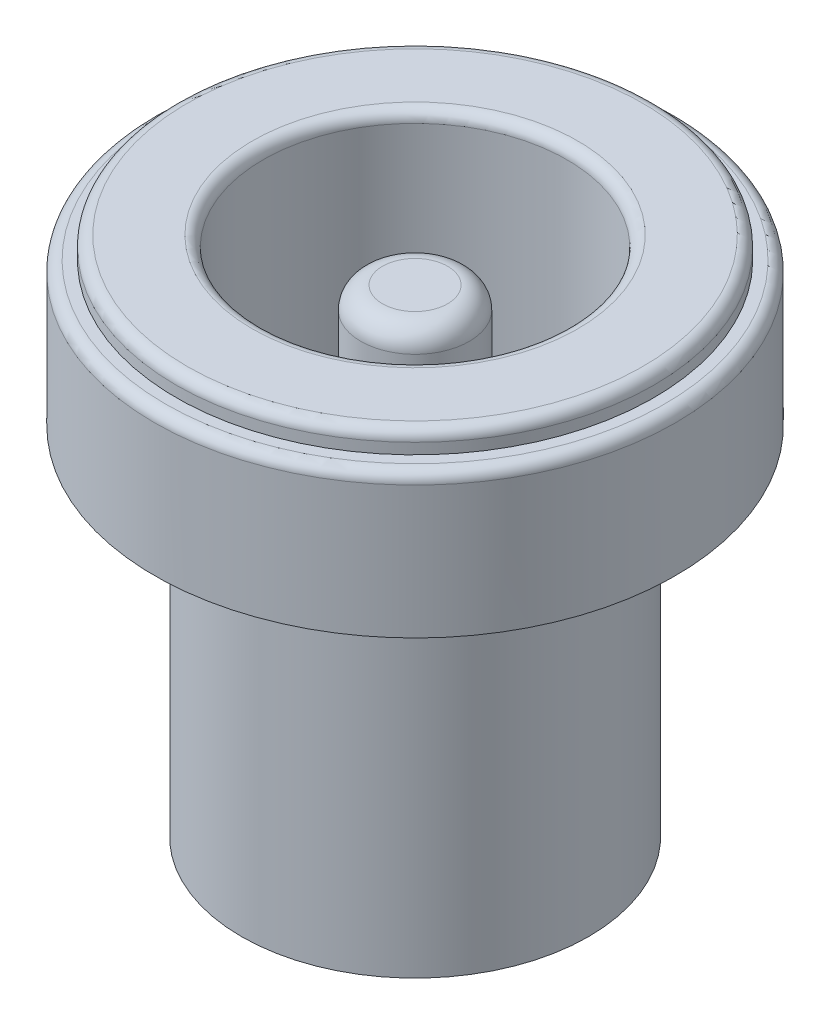
ISO-10303-21;
HEADER;
FILE_DESCRIPTION(('STEP AP214'),'2;1');
FILE_NAME('part.step','',(''),(''),'','','');
FILE_SCHEMA(('AUTOMOTIVE_DESIGN { 1 0 10303 214 1 1 1 1 }'));
ENDSEC;
DATA;
#1=APPLICATION_CONTEXT('core data for automotive mechanical design processes');
#2=APPLICATION_PROTOCOL_DEFINITION('international standard','automotive_design',2000,#1);
#3=PRODUCT_CONTEXT('',#1,'mechanical');
#4=PRODUCT('Part','Part','',(#3));
#5=PRODUCT_RELATED_PRODUCT_CATEGORY('part','',(#4));
#6=PRODUCT_DEFINITION_FORMATION('','',#4);
#7=PRODUCT_DEFINITION_CONTEXT('part definition',#1,'design');
#8=PRODUCT_DEFINITION('design','',#6,#7);
#9=PRODUCT_DEFINITION_SHAPE('','',#8);
#10=(LENGTH_UNIT() NAMED_UNIT(*) SI_UNIT(.MILLI.,.METRE.));
#11=(NAMED_UNIT(*) PLANE_ANGLE_UNIT() SI_UNIT($,.RADIAN.));
#12=(NAMED_UNIT(*) SI_UNIT($,.STERADIAN.) SOLID_ANGLE_UNIT());
#13=UNCERTAINTY_MEASURE_WITH_UNIT(LENGTH_MEASURE(1.E-05),#10,'distance_accuracy_value','');
#14=(GEOMETRIC_REPRESENTATION_CONTEXT(3) GLOBAL_UNCERTAINTY_ASSIGNED_CONTEXT((#13)) GLOBAL_UNIT_ASSIGNED_CONTEXT((#10,
#11,#12)) REPRESENTATION_CONTEXT('',''));
#15=CARTESIAN_POINT('',(0.,0.,0.));
#16=DIRECTION('',(0.,0.,1.));
#17=DIRECTION('',(1.,0.,0.));
#18=AXIS2_PLACEMENT_3D('',#15,#16,#17);
#19=CARTESIAN_POINT('',(0.,-10.,0.));
#20=DIRECTION('',(0.,1.,0.));
#21=DIRECTION('',(0.,0.,1.));
#22=AXIS2_PLACEMENT_3D('',#19,#20,#21);
#23=CYLINDRICAL_SURFACE('',#22,1.25);
#24=CARTESIAN_POINT('',(0.,-1.5,0.));
#25=DIRECTION('',(0.,1.,0.));
#26=DIRECTION('',(0.,0.,1.));
#27=AXIS2_PLACEMENT_3D('',#24,#25,#26);
#28=CIRCLE('',#27,1.25);
#29=CARTESIAN_POINT('',(0.,-1.5,1.25));
#30=VERTEX_POINT('',#29);
#31=EDGE_CURVE('E81',#30,#30,#28,.F.);
#32=ORIENTED_EDGE('',*,*,#31,.T.);
#33=EDGE_LOOP('',(#32));
#34=FACE_BOUND('',#33,.T.);
#35=CARTESIAN_POINT('',(0.,-10.,0.));
#36=DIRECTION('',(0.,1.,0.));
#37=DIRECTION('',(0.,0.,1.));
#38=AXIS2_PLACEMENT_3D('',#35,#36,#37);
#39=CIRCLE('',#38,1.25);
#40=CARTESIAN_POINT('',(0.,-10.,1.25));
#41=VERTEX_POINT('',#40);
#42=EDGE_CURVE('E105',#41,#41,#39,.T.);
#43=ORIENTED_EDGE('',*,*,#42,.T.);
#44=EDGE_LOOP('',(#43));
#45=FACE_BOUND('',#44,.T.);
#46=ADVANCED_FACE('F41',(#34,#45),#23,.T.);
#47=CARTESIAN_POINT('',(0.,0.,0.));
#48=DIRECTION('',(0.,1.,0.));
#49=DIRECTION('',(0.,0.,1.));
#50=AXIS2_PLACEMENT_3D('',#47,#48,#49);
#51=PLANE('',#50);
#52=CARTESIAN_POINT('',(0.,0.,0.));
#53=DIRECTION('',(0.,1.,0.));
#54=DIRECTION('',(0.,0.,1.));
#55=AXIS2_PLACEMENT_3D('',#52,#53,#54);
#56=CIRCLE('',#55,3.75);
#57=CARTESIAN_POINT('',(0.,0.,3.75));
#58=VERTEX_POINT('',#57);
#59=EDGE_CURVE('E65',#58,#58,#56,.F.);
#60=ORIENTED_EDGE('',*,*,#59,.T.);
#61=EDGE_LOOP('',(#60));
#62=FACE_BOUND('',#61,.T.);
#63=CARTESIAN_POINT('',(0.,0.,0.));
#64=DIRECTION('',(0.,1.,0.));
#65=DIRECTION('',(0.,0.,1.));
#66=AXIS2_PLACEMENT_3D('',#63,#64,#65);
#67=CIRCLE('',#66,5.25);
#68=CARTESIAN_POINT('',(0.,0.,5.25));
#69=VERTEX_POINT('',#68);
#70=EDGE_CURVE('E69',#69,#69,#67,.T.);
#71=ORIENTED_EDGE('',*,*,#70,.T.);
#72=EDGE_LOOP('',(#71));
#73=FACE_BOUND('',#72,.T.);
#74=ADVANCED_FACE('F129',(#62,#73),#51,.T.);
#75=CARTESIAN_POINT('',(0.,-12.,0.));
#76=DIRECTION('',(0.,-1.,0.));
#77=DIRECTION('',(0.,0.,-1.));
#78=AXIS2_PLACEMENT_3D('',#75,#76,#77);
#79=CYLINDRICAL_SURFACE('',#78,5.5);
#80=CARTESIAN_POINT('',(0.,-0.25,0.));
#81=DIRECTION('',(0.,1.,0.));
#82=DIRECTION('',(0.,0.,1.));
#83=AXIS2_PLACEMENT_3D('',#80,#81,#82);
#84=CIRCLE('',#83,5.5);
#85=CARTESIAN_POINT('',(0.,-0.25,5.5));
#86=VERTEX_POINT('',#85);
#87=EDGE_CURVE('E54',#86,#86,#84,.F.);
#88=ORIENTED_EDGE('',*,*,#87,.T.);
#89=EDGE_LOOP('',(#88));
#90=FACE_BOUND('',#89,.T.);
#91=CARTESIAN_POINT('',(0.,-0.5,0.));
#92=DIRECTION('',(0.,-1.,0.));
#93=DIRECTION('',(0.,0.,-1.));
#94=AXIS2_PLACEMENT_3D('',#91,#92,#93);
#95=CIRCLE('',#94,5.5);
#96=CARTESIAN_POINT('',(0.,-0.5,-5.5));
#97=VERTEX_POINT('',#96);
#98=EDGE_CURVE('E89',#97,#97,#95,.T.);
#99=ORIENTED_EDGE('',*,*,#98,.F.);
#100=EDGE_LOOP('',(#99));
#101=FACE_BOUND('',#100,.T.);
#102=ADVANCED_FACE('F134',(#90,#101),#79,.T.);
#103=CARTESIAN_POINT('',(5.5,-0.5,0.));
#104=DIRECTION('',(0.,1.,0.));
#105=DIRECTION('',(0.,0.,1.));
#106=AXIS2_PLACEMENT_3D('',#103,#104,#105);
#107=PLANE('',#106);
#108=CARTESIAN_POINT('',(0.,-0.5,0.));
#109=DIRECTION('',(0.,1.,0.));
#110=DIRECTION('',(0.,0.,1.));
#111=AXIS2_PLACEMENT_3D('',#108,#109,#110);
#112=CIRCLE('',#111,5.75);
#113=CARTESIAN_POINT('',(0.,-0.5,5.75));
#114=VERTEX_POINT('',#113);
#115=EDGE_CURVE('E10',#114,#114,#112,.T.);
#116=ORIENTED_EDGE('',*,*,#115,.T.);
#117=EDGE_LOOP('',(#116));
#118=FACE_BOUND('',#117,.T.);
#119=ORIENTED_EDGE('',*,*,#98,.T.);
#120=EDGE_LOOP('',(#119));
#121=FACE_BOUND('',#120,.T.);
#122=ADVANCED_FACE('F167',(#118,#121),#107,.T.);
#123=CARTESIAN_POINT('',(0.,-12.,0.));
#124=DIRECTION('',(0.,-1.,0.));
#125=DIRECTION('',(0.,0.,-1.));
#126=AXIS2_PLACEMENT_3D('',#123,#124,#125);
#127=CYLINDRICAL_SURFACE('',#126,6.);
#128=CARTESIAN_POINT('',(0.,-0.749999999999999,0.));
#129=DIRECTION('',(0.,1.,0.));
#130=DIRECTION('',(0.,0.,1.));
#131=AXIS2_PLACEMENT_3D('',#128,#129,#130);
#132=CIRCLE('',#131,6.);
#133=CARTESIAN_POINT('',(0.,-0.749999999999999,6.));
#134=VERTEX_POINT('',#133);
#135=EDGE_CURVE('E49',#134,#134,#132,.F.);
#136=ORIENTED_EDGE('',*,*,#135,.T.);
#137=EDGE_LOOP('',(#136));
#138=FACE_BOUND('',#137,.T.);
#139=CARTESIAN_POINT('',(0.,-3.8,0.));
#140=DIRECTION('',(0.,-1.,0.));
#141=DIRECTION('',(0.,0.,-1.));
#142=AXIS2_PLACEMENT_3D('',#139,#140,#141);
#143=CIRCLE('',#142,6.);
#144=CARTESIAN_POINT('',(0.,-3.8,-6.));
#145=VERTEX_POINT('',#144);
#146=EDGE_CURVE('E93',#145,#145,#143,.T.);
#147=ORIENTED_EDGE('',*,*,#146,.F.);
#148=EDGE_LOOP('',(#147));
#149=FACE_BOUND('',#148,.T.);
#150=ADVANCED_FACE('F171',(#138,#149),#127,.T.);
#151=CARTESIAN_POINT('',(6.,-3.8,0.));
#152=DIRECTION('',(0.,-1.,0.));
#153=DIRECTION('',(0.,0.,-1.));
#154=AXIS2_PLACEMENT_3D('',#151,#152,#153);
#155=PLANE('',#154);
#156=ORIENTED_EDGE('',*,*,#146,.T.);
#157=EDGE_LOOP('',(#156));
#158=FACE_BOUND('',#157,.T.);
#159=CARTESIAN_POINT('',(0.,-3.8,0.));
#160=DIRECTION('',(0.,-1.,0.));
#161=DIRECTION('',(0.,0.,-1.));
#162=AXIS2_PLACEMENT_3D('',#159,#160,#161);
#163=CIRCLE('',#162,4.);
#164=CARTESIAN_POINT('',(0.,-3.8,-4.));
#165=VERTEX_POINT('',#164);
#166=EDGE_CURVE('E97',#165,#165,#163,.T.);
#167=ORIENTED_EDGE('',*,*,#166,.F.);
#168=EDGE_LOOP('',(#167));
#169=FACE_BOUND('',#168,.T.);
#170=ADVANCED_FACE('F176',(#158,#169),#155,.T.);
#171=CARTESIAN_POINT('',(0.,-12.,0.));
#172=DIRECTION('',(0.,-1.,0.));
#173=DIRECTION('',(0.,0.,-1.));
#174=AXIS2_PLACEMENT_3D('',#171,#172,#173);
#175=CYLINDRICAL_SURFACE('',#174,4.);
#176=ORIENTED_EDGE('',*,*,#166,.T.);
#177=EDGE_LOOP('',(#176));
#178=FACE_BOUND('',#177,.T.);
#179=CARTESIAN_POINT('',(0.,-12.,0.));
#180=DIRECTION('',(0.,-1.,0.));
#181=DIRECTION('',(0.,0.,-1.));
#182=AXIS2_PLACEMENT_3D('',#179,#180,#181);
#183=CIRCLE('',#182,4.);
#184=CARTESIAN_POINT('',(0.,-12.,-4.));
#185=VERTEX_POINT('',#184);
#186=EDGE_CURVE('E101',#185,#185,#183,.T.);
#187=ORIENTED_EDGE('',*,*,#186,.F.);
#188=EDGE_LOOP('',(#187));
#189=FACE_BOUND('',#188,.T.);
#190=ADVANCED_FACE('F181',(#178,#189),#175,.T.);
#191=CARTESIAN_POINT('',(4.,-12.,0.));
#192=DIRECTION('',(0.,-1.,0.));
#193=DIRECTION('',(0.,0.,-1.));
#194=AXIS2_PLACEMENT_3D('',#191,#192,#193);
#195=PLANE('',#194);
#196=ORIENTED_EDGE('',*,*,#186,.T.);
#197=EDGE_LOOP('',(#196));
#198=FACE_BOUND('',#197,.T.);
#199=ADVANCED_FACE('F124',(#198),#195,.T.);
#200=CARTESIAN_POINT('',(0.,-10.,0.));
#201=DIRECTION('',(0.,1.,0.));
#202=DIRECTION('',(0.,0.,1.));
#203=AXIS2_PLACEMENT_3D('',#200,#201,#202);
#204=CYLINDRICAL_SURFACE('',#203,3.5);
#205=CARTESIAN_POINT('',(0.,-0.25,0.));
#206=DIRECTION('',(0.,1.,0.));
#207=DIRECTION('',(0.,0.,1.));
#208=AXIS2_PLACEMENT_3D('',#205,#206,#207);
#209=CIRCLE('',#208,3.5);
#210=CARTESIAN_POINT('',(0.,-0.25,3.5));
#211=VERTEX_POINT('',#210);
#212=EDGE_CURVE('E73',#211,#211,#209,.T.);
#213=ORIENTED_EDGE('',*,*,#212,.T.);
#214=EDGE_LOOP('',(#213));
#215=FACE_BOUND('',#214,.T.);
#216=CARTESIAN_POINT('',(0.,-9.75,0.));
#217=DIRECTION('',(0.,1.,0.));
#218=DIRECTION('',(0.,0.,1.));
#219=AXIS2_PLACEMENT_3D('',#216,#217,#218);
#220=CIRCLE('',#219,3.5);
#221=CARTESIAN_POINT('',(0.,-9.75,3.5));
#222=VERTEX_POINT('',#221);
#223=EDGE_CURVE('E77',#222,#222,#220,.F.);
#224=ORIENTED_EDGE('',*,*,#223,.T.);
#225=EDGE_LOOP('',(#224));
#226=FACE_BOUND('',#225,.T.);
#227=ADVANCED_FACE('F114',(#215,#226),#204,.F.);
#228=CARTESIAN_POINT('',(0.,-10.,0.));
#229=DIRECTION('',(0.,1.,0.));
#230=DIRECTION('',(0.,0.,1.));
#231=AXIS2_PLACEMENT_3D('',#228,#229,#230);
#232=PLANE('',#231);
#233=CARTESIAN_POINT('',(0.,-10.,0.));
#234=DIRECTION('',(0.,1.,0.));
#235=DIRECTION('',(0.,0.,1.));
#236=AXIS2_PLACEMENT_3D('',#233,#234,#235);
#237=CIRCLE('',#236,3.25);
#238=CARTESIAN_POINT('',(0.,-10.,3.25));
#239=VERTEX_POINT('',#238);
#240=EDGE_CURVE('E59',#239,#239,#237,.T.);
#241=ORIENTED_EDGE('',*,*,#240,.T.);
#242=EDGE_LOOP('',(#241));
#243=FACE_BOUND('',#242,.T.);
#244=ORIENTED_EDGE('',*,*,#42,.F.);
#245=EDGE_LOOP('',(#244));
#246=FACE_BOUND('',#245,.T.);
#247=ADVANCED_FACE('F111',(#243,#246),#232,.T.);
#248=CARTESIAN_POINT('',(0.,-1.,0.));
#249=DIRECTION('',(0.,1.,0.));
#250=DIRECTION('',(0.,0.,1.));
#251=AXIS2_PLACEMENT_3D('',#248,#249,#250);
#252=PLANE('',#251);
#253=CARTESIAN_POINT('',(0.,-1.,0.));
#254=DIRECTION('',(0.,1.,0.));
#255=DIRECTION('',(0.,0.,1.));
#256=AXIS2_PLACEMENT_3D('',#253,#254,#255);
#257=CIRCLE('',#256,0.75);
#258=CARTESIAN_POINT('',(0.,-1.,0.75));
#259=VERTEX_POINT('',#258);
#260=EDGE_CURVE('E85',#259,#259,#257,.T.);
#261=ORIENTED_EDGE('',*,*,#260,.T.);
#262=EDGE_LOOP('',(#261));
#263=FACE_BOUND('',#262,.T.);
#264=ADVANCED_FACE('F113',(#263),#252,.T.);
#265=CARTESIAN_POINT('',(0.,-1.5,0.));
#266=DIRECTION('',(0.,1.,0.));
#267=DIRECTION('',(0.,0.,1.));
#268=AXIS2_PLACEMENT_3D('',#265,#266,#267);
#269=TOROIDAL_SURFACE('',#268,0.75,0.5);
#270=ORIENTED_EDGE('',*,*,#31,.F.);
#271=EDGE_LOOP('',(#270));
#272=FACE_BOUND('',#271,.T.);
#273=ORIENTED_EDGE('',*,*,#260,.F.);
#274=EDGE_LOOP('',(#273));
#275=FACE_BOUND('',#274,.T.);
#276=ADVANCED_FACE('F121',(#272,#275),#269,.T.);
#277=CARTESIAN_POINT('',(0.,-0.25,0.));
#278=DIRECTION('',(0.,1.,0.));
#279=DIRECTION('',(0.,0.,1.));
#280=AXIS2_PLACEMENT_3D('',#277,#278,#279);
#281=TOROIDAL_SURFACE('',#280,3.75,0.25);
#282=ORIENTED_EDGE('',*,*,#59,.F.);
#283=EDGE_LOOP('',(#282));
#284=FACE_BOUND('',#283,.T.);
#285=ORIENTED_EDGE('',*,*,#212,.F.);
#286=EDGE_LOOP('',(#285));
#287=FACE_BOUND('',#286,.T.);
#288=ADVANCED_FACE('F141',(#284,#287),#281,.T.);
#289=CARTESIAN_POINT('',(0.,-9.75,0.));
#290=DIRECTION('',(0.,1.,0.));
#291=DIRECTION('',(0.,0.,1.));
#292=AXIS2_PLACEMENT_3D('',#289,#290,#291);
#293=TOROIDAL_SURFACE('',#292,3.25,0.25);
#294=ORIENTED_EDGE('',*,*,#223,.F.);
#295=EDGE_LOOP('',(#294));
#296=FACE_BOUND('',#295,.T.);
#297=ORIENTED_EDGE('',*,*,#240,.F.);
#298=EDGE_LOOP('',(#297));
#299=FACE_BOUND('',#298,.T.);
#300=ADVANCED_FACE('F147',(#296,#299),#293,.F.);
#301=CARTESIAN_POINT('',(0.,-0.25,0.));
#302=DIRECTION('',(0.,1.,0.));
#303=DIRECTION('',(0.,0.,1.));
#304=AXIS2_PLACEMENT_3D('',#301,#302,#303);
#305=TOROIDAL_SURFACE('',#304,5.25,0.25);
#306=ORIENTED_EDGE('',*,*,#70,.F.);
#307=EDGE_LOOP('',(#306));
#308=FACE_BOUND('',#307,.T.);
#309=ORIENTED_EDGE('',*,*,#87,.F.);
#310=EDGE_LOOP('',(#309));
#311=FACE_BOUND('',#310,.T.);
#312=ADVANCED_FACE('F153',(#308,#311),#305,.T.);
#313=CARTESIAN_POINT('',(0.,-0.749999999999999,0.));
#314=DIRECTION('',(0.,1.,0.));
#315=DIRECTION('',(0.,0.,1.));
#316=AXIS2_PLACEMENT_3D('',#313,#314,#315);
#317=TOROIDAL_SURFACE('',#316,5.75,0.25);
#318=ORIENTED_EDGE('',*,*,#115,.F.);
#319=EDGE_LOOP('',(#318));
#320=FACE_BOUND('',#319,.T.);
#321=ORIENTED_EDGE('',*,*,#135,.F.);
#322=EDGE_LOOP('',(#321));
#323=FACE_BOUND('',#322,.T.);
#324=ADVANCED_FACE('F43',(#320,#323),#317,.T.);
#325=CLOSED_SHELL('',(#46,#74,#102,#122,#150,#170,#190,#199,#227,#247,#264,#276,#288,#300,#312,#324));
#326=MANIFOLD_SOLID_BREP('B2',#325);
#327=ADVANCED_BREP_SHAPE_REPRESENTATION('',(#18,#326),#14);
#328=SHAPE_DEFINITION_REPRESENTATION(#9,#327);
ENDSEC;
END-ISO-10303-21;
